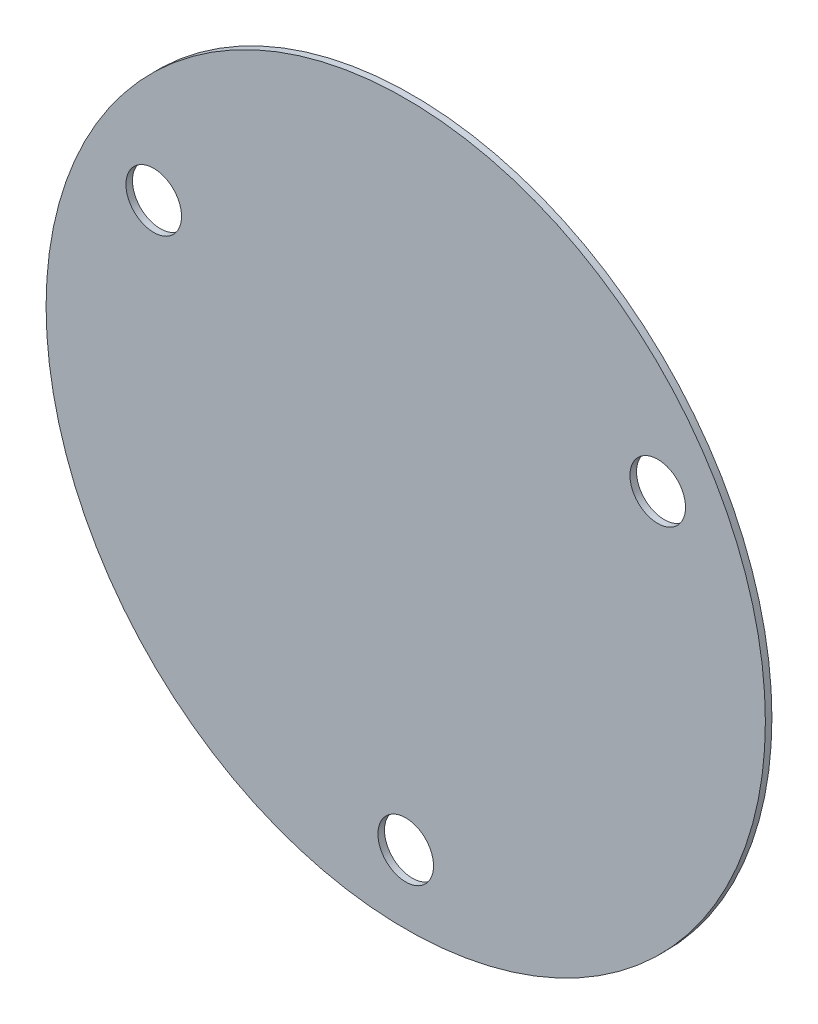
ISO-10303-21;
HEADER;
FILE_DESCRIPTION(('STEP AP214'),'2;1');
FILE_NAME('part.step','',(''),(''),'','','');
FILE_SCHEMA(('AUTOMOTIVE_DESIGN { 1 0 10303 214 1 1 1 1 }'));
ENDSEC;
DATA;
#1=APPLICATION_CONTEXT('core data for automotive mechanical design processes');
#2=APPLICATION_PROTOCOL_DEFINITION('international standard','automotive_design',2000,#1);
#3=PRODUCT_CONTEXT('',#1,'mechanical');
#4=PRODUCT('Part','Part','',(#3));
#5=PRODUCT_RELATED_PRODUCT_CATEGORY('part','',(#4));
#6=PRODUCT_DEFINITION_FORMATION('','',#4);
#7=PRODUCT_DEFINITION_CONTEXT('part definition',#1,'design');
#8=PRODUCT_DEFINITION('design','',#6,#7);
#9=PRODUCT_DEFINITION_SHAPE('','',#8);
#10=(LENGTH_UNIT() NAMED_UNIT(*) SI_UNIT(.MILLI.,.METRE.));
#11=(NAMED_UNIT(*) PLANE_ANGLE_UNIT() SI_UNIT($,.RADIAN.));
#12=(NAMED_UNIT(*) SI_UNIT($,.STERADIAN.) SOLID_ANGLE_UNIT());
#13=UNCERTAINTY_MEASURE_WITH_UNIT(LENGTH_MEASURE(1.E-05),#10,'distance_accuracy_value','');
#14=(GEOMETRIC_REPRESENTATION_CONTEXT(3) GLOBAL_UNCERTAINTY_ASSIGNED_CONTEXT((#13)) GLOBAL_UNIT_ASSIGNED_CONTEXT((#10,
#11,#12)) REPRESENTATION_CONTEXT('',''));
#15=CARTESIAN_POINT('',(0.,0.,0.));
#16=DIRECTION('',(0.,0.,1.));
#17=DIRECTION('',(1.,0.,0.));
#18=AXIS2_PLACEMENT_3D('',#15,#16,#17);
#19=CARTESIAN_POINT('',(0.,0.,-2.));
#20=DIRECTION('',(0.,0.,1.));
#21=DIRECTION('',(1.,0.,0.));
#22=AXIS2_PLACEMENT_3D('',#19,#20,#21);
#23=CYLINDRICAL_SURFACE('',#22,110.);
#24=CARTESIAN_POINT('',(0.,0.,-2.));
#25=DIRECTION('',(0.,0.,1.));
#26=DIRECTION('',(1.,0.,0.));
#27=AXIS2_PLACEMENT_3D('',#24,#25,#26);
#28=CIRCLE('',#27,110.);
#29=CARTESIAN_POINT('',(110.,0.,-2.));
#30=VERTEX_POINT('',#29);
#31=EDGE_CURVE('E10',#30,#30,#28,.T.);
#32=ORIENTED_EDGE('',*,*,#31,.T.);
#33=EDGE_LOOP('',(#32));
#34=FACE_BOUND('',#33,.T.);
#35=CARTESIAN_POINT('',(0.,0.,0.));
#36=DIRECTION('',(0.,0.,1.));
#37=DIRECTION('',(1.,0.,0.));
#38=AXIS2_PLACEMENT_3D('',#35,#36,#37);
#39=CIRCLE('',#38,110.);
#40=CARTESIAN_POINT('',(110.,0.,0.));
#41=VERTEX_POINT('',#40);
#42=EDGE_CURVE('E50',#41,#41,#39,.T.);
#43=ORIENTED_EDGE('',*,*,#42,.F.);
#44=EDGE_LOOP('',(#43));
#45=FACE_BOUND('',#44,.T.);
#46=ADVANCED_FACE('F47',(#34,#45),#23,.T.);
#47=CARTESIAN_POINT('',(0.,0.,-2.));
#48=DIRECTION('',(0.,0.,1.));
#49=DIRECTION('',(1.,0.,0.));
#50=AXIS2_PLACEMENT_3D('',#47,#48,#49);
#51=PLANE('',#50);
#52=CARTESIAN_POINT('',(-77.0762609368145,44.5000000000009,-2.));
#53=DIRECTION('',(0.,0.,1.));
#54=DIRECTION('',(1.,0.,0.));
#55=AXIS2_PLACEMENT_3D('',#52,#53,#54);
#56=CIRCLE('',#55,8.5);
#57=CARTESIAN_POINT('',(-68.5762609368145,44.5000000000009,-2.));
#58=VERTEX_POINT('',#57);
#59=EDGE_CURVE('E74',#58,#58,#56,.T.);
#60=ORIENTED_EDGE('',*,*,#59,.T.);
#61=EDGE_LOOP('',(#60));
#62=FACE_BOUND('',#61,.T.);
#63=CARTESIAN_POINT('',(-6.21483678314078E-13,-89.,-2.));
#64=DIRECTION('',(0.,0.,1.));
#65=DIRECTION('',(1.,0.,0.));
#66=AXIS2_PLACEMENT_3D('',#63,#64,#65);
#67=CIRCLE('',#66,8.5);
#68=CARTESIAN_POINT('',(8.49999999999938,-89.,-2.));
#69=VERTEX_POINT('',#68);
#70=EDGE_CURVE('E66',#69,#69,#67,.T.);
#71=ORIENTED_EDGE('',*,*,#70,.T.);
#72=EDGE_LOOP('',(#71));
#73=FACE_BOUND('',#72,.T.);
#74=CARTESIAN_POINT('',(77.0762609368151,44.4999999999998,-2.));
#75=DIRECTION('',(0.,0.,1.));
#76=DIRECTION('',(1.,0.,0.));
#77=AXIS2_PLACEMENT_3D('',#74,#75,#76);
#78=CIRCLE('',#77,8.50000000000003);
#79=CARTESIAN_POINT('',(85.5762609368152,44.4999999999998,-2.));
#80=VERTEX_POINT('',#79);
#81=EDGE_CURVE('E60',#80,#80,#78,.T.);
#82=ORIENTED_EDGE('',*,*,#81,.T.);
#83=EDGE_LOOP('',(#82));
#84=FACE_BOUND('',#83,.T.);
#85=ORIENTED_EDGE('',*,*,#31,.F.);
#86=EDGE_LOOP('',(#85));
#87=FACE_BOUND('',#86,.T.);
#88=ADVANCED_FACE('F87',(#62,#73,#84,#87),#51,.F.);
#89=CARTESIAN_POINT('',(0.,0.,0.));
#90=DIRECTION('',(0.,0.,1.));
#91=DIRECTION('',(1.,0.,0.));
#92=AXIS2_PLACEMENT_3D('',#89,#90,#91);
#93=PLANE('',#92);
#94=CARTESIAN_POINT('',(-77.0762609368145,44.5000000000009,0.));
#95=DIRECTION('',(0.,0.,1.));
#96=DIRECTION('',(1.,0.,0.));
#97=AXIS2_PLACEMENT_3D('',#94,#95,#96);
#98=CIRCLE('',#97,8.5);
#99=CARTESIAN_POINT('',(-68.5762609368145,44.5000000000009,0.));
#100=VERTEX_POINT('',#99);
#101=EDGE_CURVE('E78',#100,#100,#98,.T.);
#102=ORIENTED_EDGE('',*,*,#101,.F.);
#103=EDGE_LOOP('',(#102));
#104=FACE_BOUND('',#103,.T.);
#105=CARTESIAN_POINT('',(-6.21483678314078E-13,-89.,0.));
#106=DIRECTION('',(0.,0.,1.));
#107=DIRECTION('',(1.,0.,0.));
#108=AXIS2_PLACEMENT_3D('',#105,#106,#107);
#109=CIRCLE('',#108,8.5);
#110=CARTESIAN_POINT('',(8.49999999999938,-89.,0.));
#111=VERTEX_POINT('',#110);
#112=EDGE_CURVE('E70',#111,#111,#109,.T.);
#113=ORIENTED_EDGE('',*,*,#112,.F.);
#114=EDGE_LOOP('',(#113));
#115=FACE_BOUND('',#114,.T.);
#116=CARTESIAN_POINT('',(77.0762609368151,44.4999999999998,0.));
#117=DIRECTION('',(0.,0.,1.));
#118=DIRECTION('',(1.,0.,0.));
#119=AXIS2_PLACEMENT_3D('',#116,#117,#118);
#120=CIRCLE('',#119,8.50000000000003);
#121=CARTESIAN_POINT('',(85.5762609368152,44.4999999999998,0.));
#122=VERTEX_POINT('',#121);
#123=EDGE_CURVE('E62',#122,#122,#120,.T.);
#124=ORIENTED_EDGE('',*,*,#123,.F.);
#125=EDGE_LOOP('',(#124));
#126=FACE_BOUND('',#125,.T.);
#127=ORIENTED_EDGE('',*,*,#42,.T.);
#128=EDGE_LOOP('',(#127));
#129=FACE_BOUND('',#128,.T.);
#130=ADVANCED_FACE('F97',(#104,#115,#126,#129),#93,.T.);
#131=CARTESIAN_POINT('',(77.0762609368151,44.4999999999998,-2.));
#132=DIRECTION('',(0.,0.,1.));
#133=DIRECTION('',(1.,0.,0.));
#134=AXIS2_PLACEMENT_3D('',#131,#132,#133);
#135=CYLINDRICAL_SURFACE('',#134,8.50000000000003);
#136=ORIENTED_EDGE('',*,*,#81,.F.);
#137=EDGE_LOOP('',(#136));
#138=FACE_BOUND('',#137,.T.);
#139=ORIENTED_EDGE('',*,*,#123,.T.);
#140=EDGE_LOOP('',(#139));
#141=FACE_BOUND('',#140,.T.);
#142=ADVANCED_FACE('F100',(#138,#141),#135,.F.);
#143=CARTESIAN_POINT('',(-6.21483678314078E-13,-89.,-2.));
#144=DIRECTION('',(0.,0.,1.));
#145=DIRECTION('',(1.,0.,0.));
#146=AXIS2_PLACEMENT_3D('',#143,#144,#145);
#147=CYLINDRICAL_SURFACE('',#146,8.5);
#148=ORIENTED_EDGE('',*,*,#70,.F.);
#149=EDGE_LOOP('',(#148));
#150=FACE_BOUND('',#149,.T.);
#151=ORIENTED_EDGE('',*,*,#112,.T.);
#152=EDGE_LOOP('',(#151));
#153=FACE_BOUND('',#152,.T.);
#154=ADVANCED_FACE('F93',(#150,#153),#147,.F.);
#155=CARTESIAN_POINT('',(-77.0762609368145,44.5000000000009,-2.));
#156=DIRECTION('',(0.,0.,1.));
#157=DIRECTION('',(1.,0.,0.));
#158=AXIS2_PLACEMENT_3D('',#155,#156,#157);
#159=CYLINDRICAL_SURFACE('',#158,8.5);
#160=ORIENTED_EDGE('',*,*,#59,.F.);
#161=EDGE_LOOP('',(#160));
#162=FACE_BOUND('',#161,.T.);
#163=ORIENTED_EDGE('',*,*,#101,.T.);
#164=EDGE_LOOP('',(#163));
#165=FACE_BOUND('',#164,.T.);
#166=ADVANCED_FACE('F90',(#162,#165),#159,.F.);
#167=CLOSED_SHELL('',(#46,#88,#130,#142,#154,#166));
#168=MANIFOLD_SOLID_BREP('B2',#167);
#169=ADVANCED_BREP_SHAPE_REPRESENTATION('',(#18,#168),#14);
#170=SHAPE_DEFINITION_REPRESENTATION(#9,#169);
ENDSEC;
END-ISO-10303-21;
